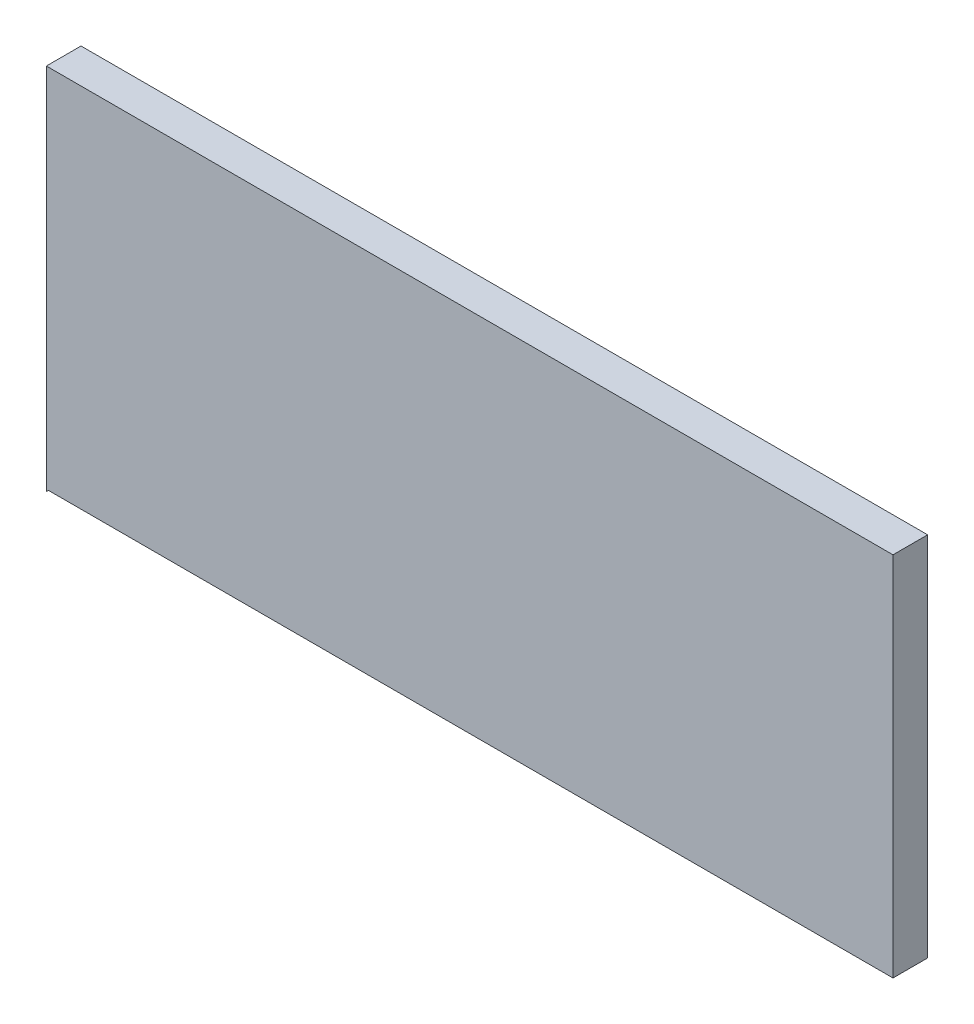
ISO-10303-21;
HEADER;
FILE_DESCRIPTION(('STEP AP214'),'2;1');
FILE_NAME('part.step','',(''),(''),'','','');
FILE_SCHEMA(('AUTOMOTIVE_DESIGN { 1 0 10303 214 1 1 1 1 }'));
ENDSEC;
DATA;
#1=APPLICATION_CONTEXT('core data for automotive mechanical design processes');
#2=APPLICATION_PROTOCOL_DEFINITION('international standard','automotive_design',2000,#1);
#3=PRODUCT_CONTEXT('',#1,'mechanical');
#4=PRODUCT('Part','Part','',(#3));
#5=PRODUCT_RELATED_PRODUCT_CATEGORY('part','',(#4));
#6=PRODUCT_DEFINITION_FORMATION('','',#4);
#7=PRODUCT_DEFINITION_CONTEXT('part definition',#1,'design');
#8=PRODUCT_DEFINITION('design','',#6,#7);
#9=PRODUCT_DEFINITION_SHAPE('','',#8);
#10=(LENGTH_UNIT() NAMED_UNIT(*) SI_UNIT(.MILLI.,.METRE.));
#11=(NAMED_UNIT(*) PLANE_ANGLE_UNIT() SI_UNIT($,.RADIAN.));
#12=(NAMED_UNIT(*) SI_UNIT($,.STERADIAN.) SOLID_ANGLE_UNIT());
#13=UNCERTAINTY_MEASURE_WITH_UNIT(LENGTH_MEASURE(1.E-05),#10,'distance_accuracy_value','');
#14=(GEOMETRIC_REPRESENTATION_CONTEXT(3) GLOBAL_UNCERTAINTY_ASSIGNED_CONTEXT((#13)) GLOBAL_UNIT_ASSIGNED_CONTEXT((#10,
#11,#12)) REPRESENTATION_CONTEXT('',''));
#15=CARTESIAN_POINT('',(0.,0.,0.));
#16=DIRECTION('',(0.,0.,1.));
#17=DIRECTION('',(1.,0.,0.));
#18=AXIS2_PLACEMENT_3D('',#15,#16,#17);
#19=CARTESIAN_POINT('',(6.11000048,2.65999976,0.499999));
#20=DIRECTION('',(0.,0.,1.));
#21=DIRECTION('',(1.,0.,0.));
#22=AXIS2_PLACEMENT_3D('',#19,#20,#21);
#23=PLANE('',#22);
#24=DIRECTION('',(1.,0.,0.));
#25=VECTOR('',#24,1.);
#26=CARTESIAN_POINT('',(-6.11000048,2.65999976,0.499999));
#27=LINE('',#26,#25);
#28=CARTESIAN_POINT('',(-6.11000048,2.65999976,0.499999));
#29=VERTEX_POINT('',#28);
#30=CARTESIAN_POINT('',(6.11000048,2.65999976,0.499999));
#31=VERTEX_POINT('',#30);
#32=EDGE_CURVE('E26',#29,#31,#27,.T.);
#33=ORIENTED_EDGE('',*,*,#32,.F.);
#34=DIRECTION('',(0.,1.,0.));
#35=VECTOR('',#34,1.);
#36=CARTESIAN_POINT('',(-6.11000048,-2.65999976,0.499999));
#37=LINE('',#36,#35);
#38=CARTESIAN_POINT('',(-6.11000048,-2.65999976,0.499999));
#39=VERTEX_POINT('',#38);
#40=EDGE_CURVE('E107',#39,#29,#37,.T.);
#41=ORIENTED_EDGE('',*,*,#40,.F.);
#42=DIRECTION('',(-0.707106781187048,-0.707106781186048,0.));
#43=VECTOR('',#42,1.);
#44=CARTESIAN_POINT('',(-6.08000054,-2.62999982,0.499999));
#45=LINE('',#44,#43);
#46=CARTESIAN_POINT('',(-6.08000054,-2.62999982,0.499999));
#47=VERTEX_POINT('',#46);
#48=EDGE_CURVE('E113',#47,#39,#45,.T.);
#49=ORIENTED_EDGE('',*,*,#48,.F.);
#50=DIRECTION('',(-1.,0.,0.));
#51=VECTOR('',#50,1.);
#52=CARTESIAN_POINT('',(6.11000048,-2.62999982,0.499999));
#53=LINE('',#52,#51);
#54=CARTESIAN_POINT('',(6.11000048,-2.62999982,0.499999));
#55=VERTEX_POINT('',#54);
#56=EDGE_CURVE('E86',#55,#47,#53,.T.);
#57=ORIENTED_EDGE('',*,*,#56,.F.);
#58=DIRECTION('',(0.,-1.,0.));
#59=VECTOR('',#58,1.);
#60=CARTESIAN_POINT('',(6.11000048,2.65999976,0.499999));
#61=LINE('',#60,#59);
#62=EDGE_CURVE('E84',#31,#55,#61,.T.);
#63=ORIENTED_EDGE('',*,*,#62,.F.);
#64=EDGE_LOOP('',(#33,#41,#49,#57,#63));
#65=FACE_BOUND('',#64,.T.);
#66=ADVANCED_FACE('F17',(#65),#23,.T.);
#67=CARTESIAN_POINT('',(6.11000048,2.65999976,0.));
#68=DIRECTION('',(0.,0.,1.));
#69=DIRECTION('',(1.,0.,0.));
#70=AXIS2_PLACEMENT_3D('',#67,#68,#69);
#71=PLANE('',#70);
#72=DIRECTION('',(0.,-1.,0.));
#73=VECTOR('',#72,1.);
#74=CARTESIAN_POINT('',(6.11000048,2.65999976,0.));
#75=LINE('',#74,#73);
#76=CARTESIAN_POINT('',(6.11000048,2.65999976,0.));
#77=VERTEX_POINT('',#76);
#78=CARTESIAN_POINT('',(6.11000048,-2.62999982,0.));
#79=VERTEX_POINT('',#78);
#80=EDGE_CURVE('E96',#77,#79,#75,.T.);
#81=ORIENTED_EDGE('',*,*,#80,.T.);
#82=DIRECTION('',(-1.,0.,0.));
#83=VECTOR('',#82,1.);
#84=CARTESIAN_POINT('',(6.11000048,-2.62999982,0.));
#85=LINE('',#84,#83);
#86=CARTESIAN_POINT('',(-6.08000054,-2.62999982,0.));
#87=VERTEX_POINT('',#86);
#88=EDGE_CURVE('E109',#79,#87,#85,.T.);
#89=ORIENTED_EDGE('',*,*,#88,.T.);
#90=DIRECTION('',(-0.707106781187048,-0.707106781186048,0.));
#91=VECTOR('',#90,1.);
#92=CARTESIAN_POINT('',(-6.08000054,-2.62999982,0.));
#93=LINE('',#92,#91);
#94=CARTESIAN_POINT('',(-6.11000048,-2.65999976,0.));
#95=VERTEX_POINT('',#94);
#96=EDGE_CURVE('E103',#87,#95,#93,.T.);
#97=ORIENTED_EDGE('',*,*,#96,.T.);
#98=DIRECTION('',(0.,1.,0.));
#99=VECTOR('',#98,1.);
#100=CARTESIAN_POINT('',(-6.11000048,-2.65999976,0.));
#101=LINE('',#100,#99);
#102=CARTESIAN_POINT('',(-6.11000048,2.65999976,0.));
#103=VERTEX_POINT('',#102);
#104=EDGE_CURVE('E20',#95,#103,#101,.T.);
#105=ORIENTED_EDGE('',*,*,#104,.T.);
#106=DIRECTION('',(1.,0.,0.));
#107=VECTOR('',#106,1.);
#108=CARTESIAN_POINT('',(-6.11000048,2.65999976,0.));
#109=LINE('',#108,#107);
#110=EDGE_CURVE('E11',#103,#77,#109,.T.);
#111=ORIENTED_EDGE('',*,*,#110,.T.);
#112=EDGE_LOOP('',(#81,#89,#97,#105,#111));
#113=FACE_BOUND('',#112,.T.);
#114=ADVANCED_FACE('F139',(#113),#71,.F.);
#115=CARTESIAN_POINT('',(-6.11000048,2.65999976,0.));
#116=DIRECTION('',(0.,1.,0.));
#117=DIRECTION('',(1.,0.,0.));
#118=AXIS2_PLACEMENT_3D('',#115,#116,#117);
#119=PLANE('',#118);
#120=DIRECTION('',(0.,0.,1.));
#121=VECTOR('',#120,1.);
#122=CARTESIAN_POINT('',(-6.11000048,2.65999976,0.));
#123=LINE('',#122,#121);
#124=EDGE_CURVE('E79',#103,#29,#123,.T.);
#125=ORIENTED_EDGE('',*,*,#124,.T.);
#126=ORIENTED_EDGE('',*,*,#32,.T.);
#127=DIRECTION('',(0.,0.,1.));
#128=VECTOR('',#127,1.);
#129=CARTESIAN_POINT('',(6.11000048,2.65999976,0.));
#130=LINE('',#129,#128);
#131=EDGE_CURVE('E77',#77,#31,#130,.T.);
#132=ORIENTED_EDGE('',*,*,#131,.F.);
#133=ORIENTED_EDGE('',*,*,#110,.F.);
#134=EDGE_LOOP('',(#125,#126,#132,#133));
#135=FACE_BOUND('',#134,.T.);
#136=ADVANCED_FACE('F75',(#135),#119,.T.);
#137=CARTESIAN_POINT('',(-6.11000048,-2.65999976,0.));
#138=DIRECTION('',(-1.,0.,0.));
#139=DIRECTION('',(0.,0.,1.));
#140=AXIS2_PLACEMENT_3D('',#137,#138,#139);
#141=PLANE('',#140);
#142=DIRECTION('',(0.,0.,1.));
#143=VECTOR('',#142,1.);
#144=CARTESIAN_POINT('',(-6.11000048,-2.65999976,0.));
#145=LINE('',#144,#143);
#146=EDGE_CURVE('E108',#95,#39,#145,.T.);
#147=ORIENTED_EDGE('',*,*,#146,.T.);
#148=ORIENTED_EDGE('',*,*,#40,.T.);
#149=ORIENTED_EDGE('',*,*,#124,.F.);
#150=ORIENTED_EDGE('',*,*,#104,.F.);
#151=EDGE_LOOP('',(#147,#148,#149,#150));
#152=FACE_BOUND('',#151,.T.);
#153=ADVANCED_FACE('F142',(#152),#141,.T.);
#154=CARTESIAN_POINT('',(-6.08000054,-2.62999982,0.));
#155=DIRECTION('',(0.707106781186048,-0.707106781187048,0.));
#156=DIRECTION('',(0.,0.,-1.));
#157=AXIS2_PLACEMENT_3D('',#154,#155,#156);
#158=PLANE('',#157);
#159=DIRECTION('',(0.,0.,1.));
#160=VECTOR('',#159,1.);
#161=CARTESIAN_POINT('',(-6.08000054,-2.62999982,0.));
#162=LINE('',#161,#160);
#163=EDGE_CURVE('E114',#87,#47,#162,.T.);
#164=ORIENTED_EDGE('',*,*,#163,.T.);
#165=ORIENTED_EDGE('',*,*,#48,.T.);
#166=ORIENTED_EDGE('',*,*,#146,.F.);
#167=ORIENTED_EDGE('',*,*,#96,.F.);
#168=EDGE_LOOP('',(#164,#165,#166,#167));
#169=FACE_BOUND('',#168,.T.);
#170=ADVANCED_FACE('F145',(#169),#158,.T.);
#171=CARTESIAN_POINT('',(6.11000048,-2.62999982,0.));
#172=DIRECTION('',(0.,-1.,0.));
#173=DIRECTION('',(0.,0.,-1.));
#174=AXIS2_PLACEMENT_3D('',#171,#172,#173);
#175=PLANE('',#174);
#176=DIRECTION('',(0.,0.,1.));
#177=VECTOR('',#176,1.);
#178=CARTESIAN_POINT('',(6.11000048,-2.62999982,0.));
#179=LINE('',#178,#177);
#180=EDGE_CURVE('E91',#79,#55,#179,.T.);
#181=ORIENTED_EDGE('',*,*,#180,.T.);
#182=ORIENTED_EDGE('',*,*,#56,.T.);
#183=ORIENTED_EDGE('',*,*,#163,.F.);
#184=ORIENTED_EDGE('',*,*,#88,.F.);
#185=EDGE_LOOP('',(#181,#182,#183,#184));
#186=FACE_BOUND('',#185,.T.);
#187=ADVANCED_FACE('F147',(#186),#175,.T.);
#188=CARTESIAN_POINT('',(6.11000048,2.65999976,0.));
#189=DIRECTION('',(1.,0.,0.));
#190=DIRECTION('',(0.,1.,0.));
#191=AXIS2_PLACEMENT_3D('',#188,#189,#190);
#192=PLANE('',#191);
#193=ORIENTED_EDGE('',*,*,#131,.T.);
#194=ORIENTED_EDGE('',*,*,#62,.T.);
#195=ORIENTED_EDGE('',*,*,#180,.F.);
#196=ORIENTED_EDGE('',*,*,#80,.F.);
#197=EDGE_LOOP('',(#193,#194,#195,#196));
#198=FACE_BOUND('',#197,.T.);
#199=ADVANCED_FACE('F94',(#198),#192,.T.);
#200=CLOSED_SHELL('',(#66,#114,#136,#153,#170,#187,#199));
#201=MANIFOLD_SOLID_BREP('B1',#200);
#202=ADVANCED_BREP_SHAPE_REPRESENTATION('',(#18,#201),#14);
#203=SHAPE_DEFINITION_REPRESENTATION(#9,#202);
ENDSEC;
END-ISO-10303-21;
